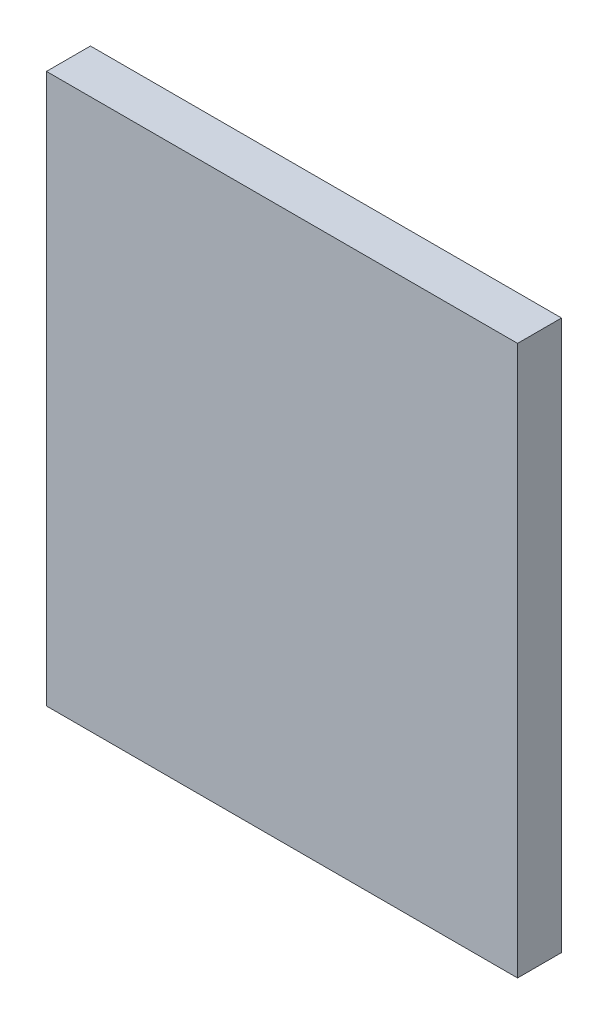
ISO-10303-21;
HEADER;
FILE_DESCRIPTION(('STEP AP214'),'2;1');
FILE_NAME('part.step','',(''),(''),'','','');
FILE_SCHEMA(('AUTOMOTIVE_DESIGN { 1 0 10303 214 1 1 1 1 }'));
ENDSEC;
DATA;
#1=APPLICATION_CONTEXT('core data for automotive mechanical design processes');
#2=APPLICATION_PROTOCOL_DEFINITION('international standard','automotive_design',2000,#1);
#3=PRODUCT_CONTEXT('',#1,'mechanical');
#4=PRODUCT('Part','Part','',(#3));
#5=PRODUCT_RELATED_PRODUCT_CATEGORY('part','',(#4));
#6=PRODUCT_DEFINITION_FORMATION('','',#4);
#7=PRODUCT_DEFINITION_CONTEXT('part definition',#1,'design');
#8=PRODUCT_DEFINITION('design','',#6,#7);
#9=PRODUCT_DEFINITION_SHAPE('','',#8);
#10=(LENGTH_UNIT() NAMED_UNIT(*) SI_UNIT(.MILLI.,.METRE.));
#11=(NAMED_UNIT(*) PLANE_ANGLE_UNIT() SI_UNIT($,.RADIAN.));
#12=(NAMED_UNIT(*) SI_UNIT($,.STERADIAN.) SOLID_ANGLE_UNIT());
#13=UNCERTAINTY_MEASURE_WITH_UNIT(LENGTH_MEASURE(1.E-05),#10,'distance_accuracy_value','');
#14=(GEOMETRIC_REPRESENTATION_CONTEXT(3) GLOBAL_UNCERTAINTY_ASSIGNED_CONTEXT((#13)) GLOBAL_UNIT_ASSIGNED_CONTEXT((#10,
#11,#12)) REPRESENTATION_CONTEXT('',''));
#15=CARTESIAN_POINT('',(0.,0.,0.));
#16=DIRECTION('',(0.,0.,1.));
#17=DIRECTION('',(1.,0.,0.));
#18=AXIS2_PLACEMENT_3D('',#15,#16,#17);
#19=CARTESIAN_POINT('',(76.2,-88.9,14.224));
#20=DIRECTION('',(-1.,0.,0.));
#21=DIRECTION('',(0.,0.,1.));
#22=AXIS2_PLACEMENT_3D('',#19,#20,#21);
#23=PLANE('',#22);
#24=DIRECTION('',(0.,1.,0.));
#25=VECTOR('',#24,1.);
#26=CARTESIAN_POINT('',(76.2,-88.9,0.));
#27=LINE('',#26,#25);
#28=CARTESIAN_POINT('',(76.2,-88.9,0.));
#29=VERTEX_POINT('',#28);
#30=CARTESIAN_POINT('',(76.2,88.9,0.));
#31=VERTEX_POINT('',#30);
#32=EDGE_CURVE('E107',#29,#31,#27,.T.);
#33=ORIENTED_EDGE('',*,*,#32,.T.);
#34=DIRECTION('',(0.,0.,-1.));
#35=VECTOR('',#34,1.);
#36=CARTESIAN_POINT('',(76.2,88.9,14.224));
#37=LINE('',#36,#35);
#38=CARTESIAN_POINT('',(76.2,88.9,14.224));
#39=VERTEX_POINT('',#38);
#40=EDGE_CURVE('E11',#39,#31,#37,.T.);
#41=ORIENTED_EDGE('',*,*,#40,.F.);
#42=DIRECTION('',(0.,1.,0.));
#43=VECTOR('',#42,1.);
#44=CARTESIAN_POINT('',(76.2,-88.9,14.224));
#45=LINE('',#44,#43);
#46=CARTESIAN_POINT('',(76.2,-88.9,14.224));
#47=VERTEX_POINT('',#46);
#48=EDGE_CURVE('E91',#47,#39,#45,.T.);
#49=ORIENTED_EDGE('',*,*,#48,.F.);
#50=DIRECTION('',(0.,0.,-1.));
#51=VECTOR('',#50,1.);
#52=CARTESIAN_POINT('',(76.2,-88.9,14.224));
#53=LINE('',#52,#51);
#54=EDGE_CURVE('E103',#47,#29,#53,.T.);
#55=ORIENTED_EDGE('',*,*,#54,.T.);
#56=EDGE_LOOP('',(#33,#41,#49,#55));
#57=FACE_BOUND('',#56,.T.);
#58=ADVANCED_FACE('F39',(#57),#23,.F.);
#59=CARTESIAN_POINT('',(-76.2,88.9,14.224));
#60=DIRECTION('',(0.,-1.,0.));
#61=DIRECTION('',(0.,0.,-1.));
#62=AXIS2_PLACEMENT_3D('',#59,#60,#61);
#63=PLANE('',#62);
#64=DIRECTION('',(-1.,0.,0.));
#65=VECTOR('',#64,1.);
#66=CARTESIAN_POINT('',(-76.2,88.9,0.));
#67=LINE('',#66,#65);
#68=CARTESIAN_POINT('',(-76.2,88.9,0.));
#69=VERTEX_POINT('',#68);
#70=EDGE_CURVE('E96',#31,#69,#67,.T.);
#71=ORIENTED_EDGE('',*,*,#70,.T.);
#72=DIRECTION('',(0.,0.,-1.));
#73=VECTOR('',#72,1.);
#74=CARTESIAN_POINT('',(-76.2,88.9,14.224));
#75=LINE('',#74,#73);
#76=CARTESIAN_POINT('',(-76.2,88.9,14.224));
#77=VERTEX_POINT('',#76);
#78=EDGE_CURVE('E48',#77,#69,#75,.T.);
#79=ORIENTED_EDGE('',*,*,#78,.F.);
#80=DIRECTION('',(-1.,0.,0.));
#81=VECTOR('',#80,1.);
#82=CARTESIAN_POINT('',(-76.2,88.9,14.224));
#83=LINE('',#82,#81);
#84=EDGE_CURVE('E86',#39,#77,#83,.T.);
#85=ORIENTED_EDGE('',*,*,#84,.F.);
#86=ORIENTED_EDGE('',*,*,#40,.T.);
#87=EDGE_LOOP('',(#71,#79,#85,#86));
#88=FACE_BOUND('',#87,.T.);
#89=ADVANCED_FACE('F95',(#88),#63,.F.);
#90=CARTESIAN_POINT('',(-76.2,-88.9,14.224));
#91=DIRECTION('',(1.,0.,0.));
#92=DIRECTION('',(0.,0.,-1.));
#93=AXIS2_PLACEMENT_3D('',#90,#91,#92);
#94=PLANE('',#93);
#95=DIRECTION('',(0.,-1.,0.));
#96=VECTOR('',#95,1.);
#97=CARTESIAN_POINT('',(-76.2,-88.9,0.));
#98=LINE('',#97,#96);
#99=CARTESIAN_POINT('',(-76.2,-88.9,0.));
#100=VERTEX_POINT('',#99);
#101=EDGE_CURVE('E73',#69,#100,#98,.T.);
#102=ORIENTED_EDGE('',*,*,#101,.T.);
#103=DIRECTION('',(0.,0.,-1.));
#104=VECTOR('',#103,1.);
#105=CARTESIAN_POINT('',(-76.2,-88.9,14.224));
#106=LINE('',#105,#104);
#107=CARTESIAN_POINT('',(-76.2,-88.9,14.224));
#108=VERTEX_POINT('',#107);
#109=EDGE_CURVE('E98',#108,#100,#106,.T.);
#110=ORIENTED_EDGE('',*,*,#109,.F.);
#111=DIRECTION('',(0.,-1.,0.));
#112=VECTOR('',#111,1.);
#113=CARTESIAN_POINT('',(-76.2,-88.9,14.224));
#114=LINE('',#113,#112);
#115=EDGE_CURVE('E89',#77,#108,#114,.T.);
#116=ORIENTED_EDGE('',*,*,#115,.F.);
#117=ORIENTED_EDGE('',*,*,#78,.T.);
#118=EDGE_LOOP('',(#102,#110,#116,#117));
#119=FACE_BOUND('',#118,.T.);
#120=ADVANCED_FACE('F99',(#119),#94,.F.);
#121=CARTESIAN_POINT('',(-76.2,-88.9,14.224));
#122=DIRECTION('',(0.,1.,0.));
#123=DIRECTION('',(0.,0.,1.));
#124=AXIS2_PLACEMENT_3D('',#121,#122,#123);
#125=PLANE('',#124);
#126=DIRECTION('',(1.,0.,0.));
#127=VECTOR('',#126,1.);
#128=CARTESIAN_POINT('',(-76.2,-88.9,0.));
#129=LINE('',#128,#127);
#130=EDGE_CURVE('E79',#100,#29,#129,.T.);
#131=ORIENTED_EDGE('',*,*,#130,.T.);
#132=ORIENTED_EDGE('',*,*,#54,.F.);
#133=DIRECTION('',(1.,0.,0.));
#134=VECTOR('',#133,1.);
#135=CARTESIAN_POINT('',(-76.2,-88.9,14.224));
#136=LINE('',#135,#134);
#137=EDGE_CURVE('E56',#108,#47,#136,.T.);
#138=ORIENTED_EDGE('',*,*,#137,.F.);
#139=ORIENTED_EDGE('',*,*,#109,.T.);
#140=EDGE_LOOP('',(#131,#132,#138,#139));
#141=FACE_BOUND('',#140,.T.);
#142=ADVANCED_FACE('F120',(#141),#125,.F.);
#143=CARTESIAN_POINT('',(0.,0.,14.224));
#144=DIRECTION('',(0.,0.,-1.));
#145=DIRECTION('',(-1.,0.,0.));
#146=AXIS2_PLACEMENT_3D('',#143,#144,#145);
#147=PLANE('',#146);
#148=ORIENTED_EDGE('',*,*,#48,.T.);
#149=ORIENTED_EDGE('',*,*,#84,.T.);
#150=ORIENTED_EDGE('',*,*,#115,.T.);
#151=ORIENTED_EDGE('',*,*,#137,.T.);
#152=EDGE_LOOP('',(#148,#149,#150,#151));
#153=FACE_BOUND('',#152,.T.);
#154=ADVANCED_FACE('F87',(#153),#147,.F.);
#155=CARTESIAN_POINT('',(0.,0.,0.));
#156=DIRECTION('',(0.,0.,-1.));
#157=DIRECTION('',(-1.,0.,0.));
#158=AXIS2_PLACEMENT_3D('',#155,#156,#157);
#159=PLANE('',#158);
#160=ORIENTED_EDGE('',*,*,#32,.F.);
#161=ORIENTED_EDGE('',*,*,#130,.F.);
#162=ORIENTED_EDGE('',*,*,#101,.F.);
#163=ORIENTED_EDGE('',*,*,#70,.F.);
#164=EDGE_LOOP('',(#160,#161,#162,#163));
#165=FACE_BOUND('',#164,.T.);
#166=ADVANCED_FACE('F123',(#165),#159,.T.);
#167=CLOSED_SHELL('',(#58,#89,#120,#142,#154,#166));
#168=MANIFOLD_SOLID_BREP('B2',#167);
#169=ADVANCED_BREP_SHAPE_REPRESENTATION('',(#18,#168),#14);
#170=SHAPE_DEFINITION_REPRESENTATION(#9,#169);
ENDSEC;
END-ISO-10303-21;
